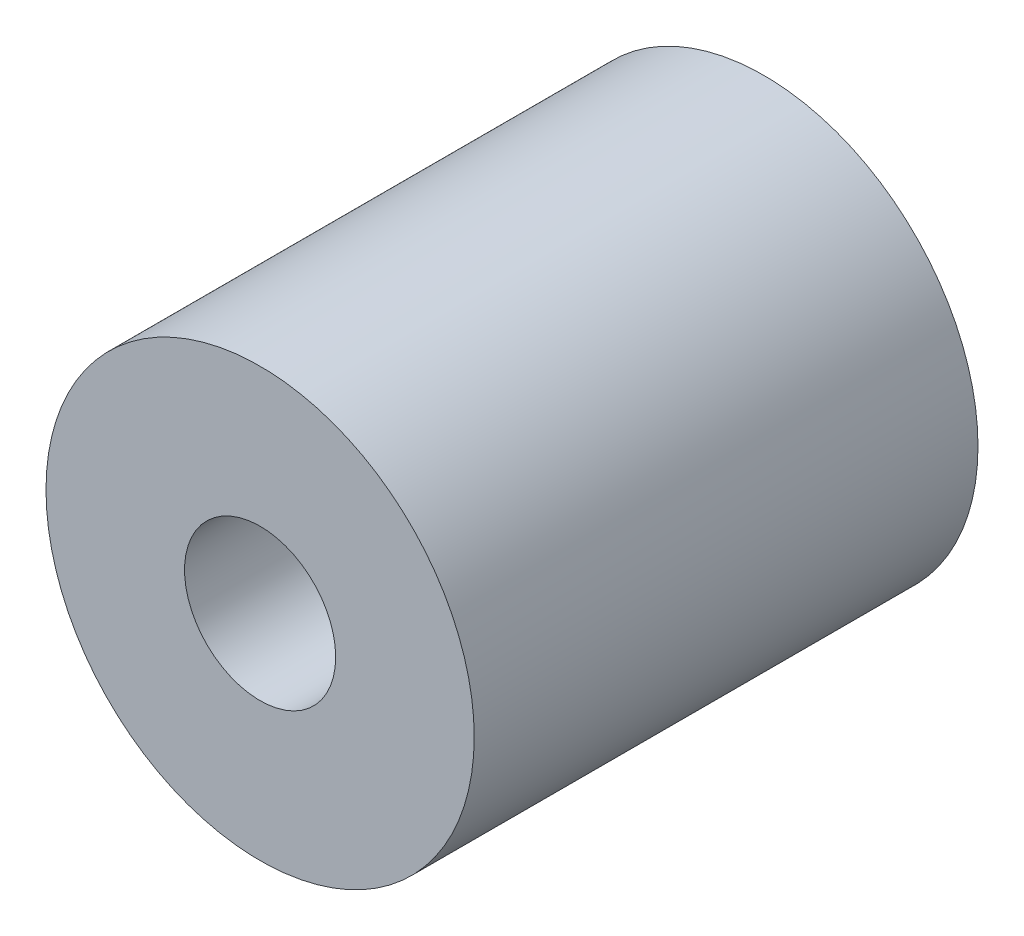
ISO-10303-21;
HEADER;
FILE_DESCRIPTION(('STEP AP214'),'2;1');
FILE_NAME('part.step','',(''),(''),'','','');
FILE_SCHEMA(('AUTOMOTIVE_DESIGN { 1 0 10303 214 1 1 1 1 }'));
ENDSEC;
DATA;
#1=APPLICATION_CONTEXT('core data for automotive mechanical design processes');
#2=APPLICATION_PROTOCOL_DEFINITION('international standard','automotive_design',2000,#1);
#3=PRODUCT_CONTEXT('',#1,'mechanical');
#4=PRODUCT('Part','Part','',(#3));
#5=PRODUCT_RELATED_PRODUCT_CATEGORY('part','',(#4));
#6=PRODUCT_DEFINITION_FORMATION('','',#4);
#7=PRODUCT_DEFINITION_CONTEXT('part definition',#1,'design');
#8=PRODUCT_DEFINITION('design','',#6,#7);
#9=PRODUCT_DEFINITION_SHAPE('','',#8);
#10=(LENGTH_UNIT() NAMED_UNIT(*) SI_UNIT(.MILLI.,.METRE.));
#11=(NAMED_UNIT(*) PLANE_ANGLE_UNIT() SI_UNIT($,.RADIAN.));
#12=(NAMED_UNIT(*) SI_UNIT($,.STERADIAN.) SOLID_ANGLE_UNIT());
#13=UNCERTAINTY_MEASURE_WITH_UNIT(LENGTH_MEASURE(1.E-05),#10,'distance_accuracy_value','');
#14=(GEOMETRIC_REPRESENTATION_CONTEXT(3) GLOBAL_UNCERTAINTY_ASSIGNED_CONTEXT((#13)) GLOBAL_UNIT_ASSIGNED_CONTEXT((#10,
#11,#12)) REPRESENTATION_CONTEXT('',''));
#15=CARTESIAN_POINT('',(0.,0.,0.));
#16=DIRECTION('',(0.,0.,1.));
#17=DIRECTION('',(1.,0.,0.));
#18=AXIS2_PLACEMENT_3D('',#15,#16,#17);
#19=CARTESIAN_POINT('',(0.,0.,20.));
#20=DIRECTION('',(0.,0.,-1.));
#21=DIRECTION('',(-1.,0.,0.));
#22=AXIS2_PLACEMENT_3D('',#19,#20,#21);
#23=CYLINDRICAL_SURFACE('',#22,8.5);
#24=CARTESIAN_POINT('',(0.,0.,20.));
#25=DIRECTION('',(0.,0.,1.));
#26=DIRECTION('',(1.,0.,0.));
#27=AXIS2_PLACEMENT_3D('',#24,#25,#26);
#28=CIRCLE('',#27,8.5);
#29=CARTESIAN_POINT('',(8.5,0.,20.));
#30=VERTEX_POINT('',#29);
#31=EDGE_CURVE('E10',#30,#30,#28,.T.);
#32=ORIENTED_EDGE('',*,*,#31,.F.);
#33=EDGE_LOOP('',(#32));
#34=FACE_BOUND('',#33,.T.);
#35=CARTESIAN_POINT('',(0.,0.,0.));
#36=DIRECTION('',(0.,0.,1.));
#37=DIRECTION('',(1.,0.,0.));
#38=AXIS2_PLACEMENT_3D('',#35,#36,#37);
#39=CIRCLE('',#38,8.5);
#40=CARTESIAN_POINT('',(8.5,0.,0.));
#41=VERTEX_POINT('',#40);
#42=EDGE_CURVE('E35',#41,#41,#39,.T.);
#43=ORIENTED_EDGE('',*,*,#42,.T.);
#44=EDGE_LOOP('',(#43));
#45=FACE_BOUND('',#44,.T.);
#46=ADVANCED_FACE('F32',(#34,#45),#23,.T.);
#47=CARTESIAN_POINT('',(0.,0.,20.));
#48=DIRECTION('',(0.,0.,1.));
#49=DIRECTION('',(1.,0.,0.));
#50=AXIS2_PLACEMENT_3D('',#47,#48,#49);
#51=PLANE('',#50);
#52=CARTESIAN_POINT('',(0.,0.,20.));
#53=DIRECTION('',(0.,0.,1.));
#54=DIRECTION('',(1.,0.,0.));
#55=AXIS2_PLACEMENT_3D('',#52,#53,#54);
#56=CIRCLE('',#55,3.);
#57=CARTESIAN_POINT('',(3.,0.,20.));
#58=VERTEX_POINT('',#57);
#59=EDGE_CURVE('E44',#58,#58,#56,.T.);
#60=ORIENTED_EDGE('',*,*,#59,.F.);
#61=EDGE_LOOP('',(#60));
#62=FACE_BOUND('',#61,.T.);
#63=ORIENTED_EDGE('',*,*,#31,.T.);
#64=EDGE_LOOP('',(#63));
#65=FACE_BOUND('',#64,.T.);
#66=ADVANCED_FACE('F59',(#62,#65),#51,.T.);
#67=CARTESIAN_POINT('',(0.,0.,0.));
#68=DIRECTION('',(0.,0.,1.));
#69=DIRECTION('',(1.,0.,0.));
#70=AXIS2_PLACEMENT_3D('',#67,#68,#69);
#71=PLANE('',#70);
#72=CARTESIAN_POINT('',(0.,0.,0.));
#73=DIRECTION('',(0.,0.,1.));
#74=DIRECTION('',(1.,0.,0.));
#75=AXIS2_PLACEMENT_3D('',#72,#73,#74);
#76=CIRCLE('',#75,3.);
#77=CARTESIAN_POINT('',(3.,0.,0.));
#78=VERTEX_POINT('',#77);
#79=EDGE_CURVE('E42',#78,#78,#76,.T.);
#80=ORIENTED_EDGE('',*,*,#79,.T.);
#81=EDGE_LOOP('',(#80));
#82=FACE_BOUND('',#81,.T.);
#83=ORIENTED_EDGE('',*,*,#42,.F.);
#84=EDGE_LOOP('',(#83));
#85=FACE_BOUND('',#84,.T.);
#86=ADVANCED_FACE('F50',(#82,#85),#71,.F.);
#87=CARTESIAN_POINT('',(0.,0.,0.));
#88=DIRECTION('',(0.,0.,1.));
#89=DIRECTION('',(1.,0.,0.));
#90=AXIS2_PLACEMENT_3D('',#87,#88,#89);
#91=CYLINDRICAL_SURFACE('',#90,3.);
#92=ORIENTED_EDGE('',*,*,#79,.F.);
#93=EDGE_LOOP('',(#92));
#94=FACE_BOUND('',#93,.T.);
#95=ORIENTED_EDGE('',*,*,#59,.T.);
#96=EDGE_LOOP('',(#95));
#97=FACE_BOUND('',#96,.T.);
#98=ADVANCED_FACE('F53',(#94,#97),#91,.F.);
#99=CLOSED_SHELL('',(#46,#66,#86,#98));
#100=MANIFOLD_SOLID_BREP('B2',#99);
#101=ADVANCED_BREP_SHAPE_REPRESENTATION('',(#18,#100),#14);
#102=SHAPE_DEFINITION_REPRESENTATION(#9,#101);
ENDSEC;
END-ISO-10303-21;
